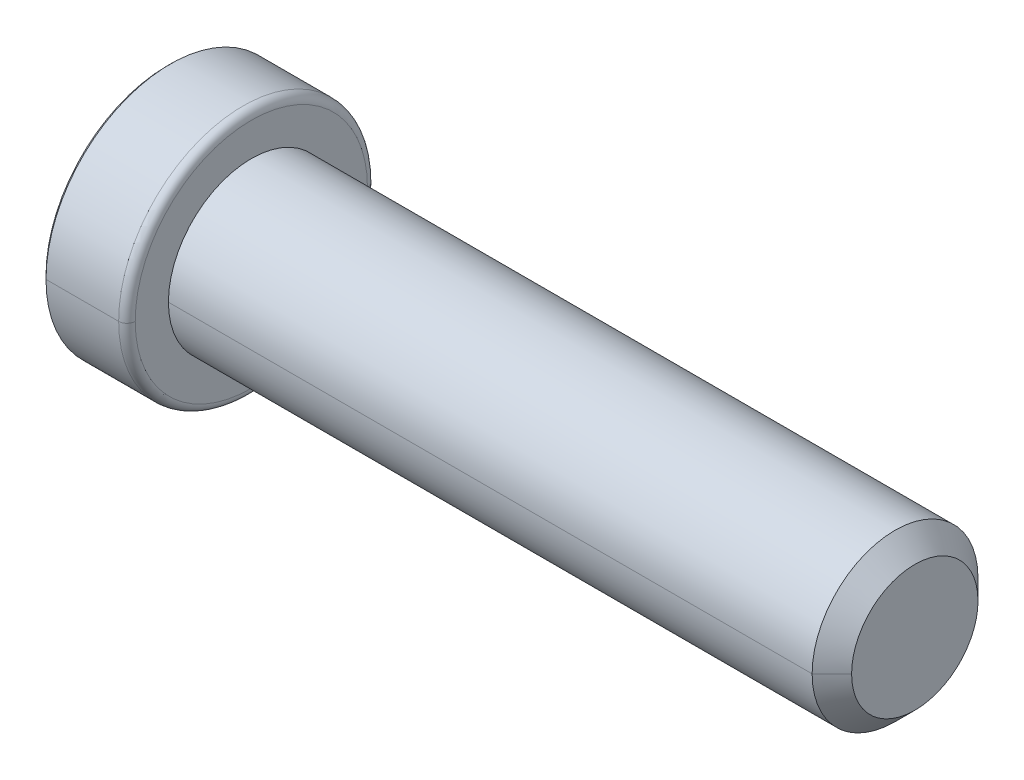
ISO-10303-21;
HEADER;
FILE_DESCRIPTION(('STEP AP214'),'2;1');
FILE_NAME('part.step','',(''),(''),'','','');
FILE_SCHEMA(('AUTOMOTIVE_DESIGN { 1 0 10303 214 1 1 1 1 }'));
ENDSEC;
DATA;
#1=APPLICATION_CONTEXT('core data for automotive mechanical design processes');
#2=APPLICATION_PROTOCOL_DEFINITION('international standard','automotive_design',2000,#1);
#3=PRODUCT_CONTEXT('',#1,'mechanical');
#4=PRODUCT('Part','Part','',(#3));
#5=PRODUCT_RELATED_PRODUCT_CATEGORY('part','',(#4));
#6=PRODUCT_DEFINITION_FORMATION('','',#4);
#7=PRODUCT_DEFINITION_CONTEXT('part definition',#1,'design');
#8=PRODUCT_DEFINITION('design','',#6,#7);
#9=PRODUCT_DEFINITION_SHAPE('','',#8);
#10=(LENGTH_UNIT() NAMED_UNIT(*) SI_UNIT(.MILLI.,.METRE.));
#11=(NAMED_UNIT(*) PLANE_ANGLE_UNIT() SI_UNIT($,.RADIAN.));
#12=(NAMED_UNIT(*) SI_UNIT($,.STERADIAN.) SOLID_ANGLE_UNIT());
#13=UNCERTAINTY_MEASURE_WITH_UNIT(LENGTH_MEASURE(1.E-05),#10,'distance_accuracy_value','');
#14=(GEOMETRIC_REPRESENTATION_CONTEXT(3) GLOBAL_UNCERTAINTY_ASSIGNED_CONTEXT((#13)) GLOBAL_UNIT_ASSIGNED_CONTEXT((#10,
#11,#12)) REPRESENTATION_CONTEXT('',''));
#15=CARTESIAN_POINT('',(0.,0.,0.));
#16=DIRECTION('',(0.,0.,1.));
#17=DIRECTION('',(1.,0.,0.));
#18=AXIS2_PLACEMENT_3D('',#15,#16,#17);
#19=CARTESIAN_POINT('',(-3.2258,0.,0.));
#20=DIRECTION('',(1.,0.,0.));
#21=DIRECTION('',(0.,-1.,0.));
#22=AXIS2_PLACEMENT_3D('',#19,#20,#21);
#23=CONICAL_SURFACE('',#22,4.6355,0.785398163397438);
#24=CARTESIAN_POINT('',(-3.0988,0.,0.));
#25=DIRECTION('',(1.,0.,0.));
#26=DIRECTION('',(0.,0.,-1.));
#27=AXIS2_PLACEMENT_3D('',#24,#25,#26);
#28=CIRCLE('',#27,4.7625);
#29=CARTESIAN_POINT('',(-3.0988,0.,-4.7625));
#30=VERTEX_POINT('',#29);
#31=CARTESIAN_POINT('',(-3.0988,0.,4.7625));
#32=VERTEX_POINT('',#31);
#33=EDGE_CURVE('E12',#30,#32,#28,.T.);
#34=ORIENTED_EDGE('',*,*,#33,.F.);
#35=CARTESIAN_POINT('',(-3.2258,0.,-4.6355));
#36=DIRECTION('',(0.707106781186555,0.,-0.70710678118654));
#37=VECTOR('',#36,1.);
#38=LINE('',#35,#37);
#39=CARTESIAN_POINT('',(-3.2258,0.,-4.6355));
#40=VERTEX_POINT('',#39);
#41=EDGE_CURVE('E30',#40,#30,#38,.T.);
#42=ORIENTED_EDGE('',*,*,#41,.F.);
#43=CARTESIAN_POINT('',(-3.2258,0.,0.));
#44=DIRECTION('',(1.,0.,0.));
#45=DIRECTION('',(0.,0.,-1.));
#46=AXIS2_PLACEMENT_3D('',#43,#44,#45);
#47=CIRCLE('',#46,4.6355);
#48=CARTESIAN_POINT('',(-3.2258,0.,4.6355));
#49=VERTEX_POINT('',#48);
#50=EDGE_CURVE('E211',#40,#49,#47,.T.);
#51=ORIENTED_EDGE('',*,*,#50,.T.);
#52=CARTESIAN_POINT('',(-3.2258,0.,4.6355));
#53=DIRECTION('',(0.707106781186555,0.,0.70710678118654));
#54=VECTOR('',#53,1.);
#55=LINE('',#52,#54);
#56=EDGE_CURVE('E209',#49,#32,#55,.T.);
#57=ORIENTED_EDGE('',*,*,#56,.T.);
#58=EDGE_LOOP('',(#34,#42,#51,#57));
#59=FACE_BOUND('',#58,.T.);
#60=ADVANCED_FACE('F20',(#59),#23,.T.);
#61=CARTESIAN_POINT('',(-3.2258,0.,0.));
#62=DIRECTION('',(1.,0.,0.));
#63=DIRECTION('',(0.,1.,0.));
#64=AXIS2_PLACEMENT_3D('',#61,#62,#63);
#65=CONICAL_SURFACE('',#64,4.6355,0.785398163397438);
#66=CARTESIAN_POINT('',(-3.2258,0.,0.));
#67=DIRECTION('',(1.,0.,0.));
#68=DIRECTION('',(0.,0.,-1.));
#69=AXIS2_PLACEMENT_3D('',#66,#67,#68);
#70=CIRCLE('',#69,4.6355);
#71=EDGE_CURVE('E195',#49,#40,#70,.T.);
#72=ORIENTED_EDGE('',*,*,#71,.T.);
#73=ORIENTED_EDGE('',*,*,#41,.T.);
#74=CARTESIAN_POINT('',(-3.0988,0.,0.));
#75=DIRECTION('',(1.,0.,0.));
#76=DIRECTION('',(0.,0.,-1.));
#77=AXIS2_PLACEMENT_3D('',#74,#75,#76);
#78=CIRCLE('',#77,4.7625);
#79=EDGE_CURVE('E364',#32,#30,#78,.T.);
#80=ORIENTED_EDGE('',*,*,#79,.F.);
#81=ORIENTED_EDGE('',*,*,#56,.F.);
#82=EDGE_LOOP('',(#72,#73,#80,#81));
#83=FACE_BOUND('',#82,.T.);
#84=ADVANCED_FACE('F338',(#83),#65,.T.);
#85=CARTESIAN_POINT('',(25.4,0.,0.));
#86=DIRECTION('',(-1.,0.,0.));
#87=DIRECTION('',(0.,1.,0.));
#88=AXIS2_PLACEMENT_3D('',#85,#86,#87);
#89=CYLINDRICAL_SURFACE('',#88,4.7625);
#90=ORIENTED_EDGE('',*,*,#79,.T.);
#91=CARTESIAN_POINT('',(-0.317499999999991,0.,-4.7625));
#92=DIRECTION('',(-1.,0.,0.));
#93=VECTOR('',#92,1.);
#94=LINE('',#91,#93);
#95=CARTESIAN_POINT('',(-0.317499999999992,0.,-4.7625));
#96=VERTEX_POINT('',#95);
#97=EDGE_CURVE('E367',#96,#30,#94,.T.);
#98=ORIENTED_EDGE('',*,*,#97,.F.);
#99=CARTESIAN_POINT('',(-0.317499999999992,0.,0.));
#100=DIRECTION('',(1.,0.,0.));
#101=DIRECTION('',(0.,0.,-1.));
#102=AXIS2_PLACEMENT_3D('',#99,#100,#101);
#103=CIRCLE('',#102,4.7625);
#104=CARTESIAN_POINT('',(-0.317500000000048,0.,4.7625));
#105=VERTEX_POINT('',#104);
#106=EDGE_CURVE('E373',#105,#96,#103,.T.);
#107=ORIENTED_EDGE('',*,*,#106,.F.);
#108=CARTESIAN_POINT('',(-0.317499999999991,0.,4.7625));
#109=DIRECTION('',(-1.,0.,0.));
#110=VECTOR('',#109,1.);
#111=LINE('',#108,#110);
#112=EDGE_CURVE('E379',#105,#32,#111,.T.);
#113=ORIENTED_EDGE('',*,*,#112,.T.);
#114=EDGE_LOOP('',(#90,#98,#107,#113));
#115=FACE_BOUND('',#114,.T.);
#116=ADVANCED_FACE('F347',(#115),#89,.T.);
#117=CARTESIAN_POINT('',(25.4,0.,0.));
#118=DIRECTION('',(-1.,0.,0.));
#119=DIRECTION('',(0.,-1.,0.));
#120=AXIS2_PLACEMENT_3D('',#117,#118,#119);
#121=CYLINDRICAL_SURFACE('',#120,4.7625);
#122=CARTESIAN_POINT('',(-0.317499999999992,0.,0.));
#123=DIRECTION('',(1.,0.,0.));
#124=DIRECTION('',(0.,0.,-1.));
#125=AXIS2_PLACEMENT_3D('',#122,#123,#124);
#126=CIRCLE('',#125,4.7625);
#127=EDGE_CURVE('E385',#96,#105,#126,.T.);
#128=ORIENTED_EDGE('',*,*,#127,.F.);
#129=ORIENTED_EDGE('',*,*,#97,.T.);
#130=ORIENTED_EDGE('',*,*,#33,.T.);
#131=ORIENTED_EDGE('',*,*,#112,.F.);
#132=EDGE_LOOP('',(#128,#129,#130,#131));
#133=FACE_BOUND('',#132,.T.);
#134=ADVANCED_FACE('F408',(#133),#121,.T.);
#135=CARTESIAN_POINT('',(-0.317500000000048,0.,0.));
#136=DIRECTION('',(1.,0.,0.));
#137=DIRECTION('',(0.,-1.,0.));
#138=AXIS2_PLACEMENT_3D('',#135,#136,#137);
#139=TOROIDAL_SURFACE('',#138,4.44499999999995,0.317500000000048);
#140=CARTESIAN_POINT('',(0.,0.,0.));
#141=DIRECTION('',(1.,0.,0.));
#142=DIRECTION('',(0.,0.,-1.));
#143=AXIS2_PLACEMENT_3D('',#140,#141,#142);
#144=CIRCLE('',#143,4.44499999999995);
#145=CARTESIAN_POINT('',(0.,0.,-4.44499999999995));
#146=VERTEX_POINT('',#145);
#147=CARTESIAN_POINT('',(0.,0.,4.44499999999995));
#148=VERTEX_POINT('',#147);
#149=EDGE_CURVE('E431',#146,#148,#144,.T.);
#150=ORIENTED_EDGE('',*,*,#149,.F.);
#151=CARTESIAN_POINT('',(-0.317500000000049,0.,-4.7625));
#152=CARTESIAN_POINT('',(-0.312304913152215,0.,-4.76250011020068));
#153=CARTESIAN_POINT('',(-0.30710983568138,0.,-4.76237249743723));
#154=CARTESIAN_POINT('',(-0.296732191120802,0.,-4.76186261725305));
#155=CARTESIAN_POINT('',(-0.291549624031059,0.,-4.76148034983231));
#156=CARTESIAN_POINT('',(-0.281209491859759,0.,-4.76046195160453));
#157=CARTESIAN_POINT('',(-0.276051926778202,0.,-4.75982582079749));
#158=CARTESIAN_POINT('',(-0.265774221942727,0.,-4.75830126303014));
#159=CARTESIAN_POINT('',(-0.260654082188809,0.,-4.75741283606983));
#160=CARTESIAN_POINT('',(-0.250463563331028,0.,-4.75538581698622));
#161=CARTESIAN_POINT('',(-0.245393184227164,0.,-4.75424722486293));
#162=CARTESIAN_POINT('',(-0.235314401534338,0.,-4.7517226209156));
#163=CARTESIAN_POINT('',(-0.230305997945375,0.,-4.75033660909157));
#164=CARTESIAN_POINT('',(-0.220363231998111,0.,-4.74732050409837));
#165=CARTESIAN_POINT('',(-0.215428869639811,0.,-4.7456904109292));
#166=CARTESIAN_POINT('',(-0.205646073456195,0.,-4.74219007046201));
#167=CARTESIAN_POINT('',(-0.20079763963088,0.,-4.74031982316399));
#168=CARTESIAN_POINT('',(-0.191198380817349,0.,-4.73634367998067));
#169=CARTESIAN_POINT('',(-0.186447555829134,0.,-4.73423778409537));
#170=CARTESIAN_POINT('',(-0.177054959842693,0.,-4.729795417038));
#171=CARTESIAN_POINT('',(-0.172413188844467,0.,-4.72745894586593));
#172=CARTESIAN_POINT('',(-0.163249883271077,0.,-4.72256105699526));
#173=CARTESIAN_POINT('',(-0.158728348695914,0.,-4.71999963929667));
#174=CARTESIAN_POINT('',(-0.149816408741438,0.,-4.71465802805348));
#175=CARTESIAN_POINT('',(-0.145426003362125,0.,-4.71187783450889));
#176=CARTESIAN_POINT('',(-0.136786898670472,0.,-4.70610536930321));
#177=CARTESIAN_POINT('',(-0.132538199358133,0.,-4.70311309764212));
#178=CARTESIAN_POINT('',(-0.124192742289212,0.,-4.69692368484806));
#179=CARTESIAN_POINT('',(-0.12009598453263,0.,-4.69372654371508));
#180=CARTESIAN_POINT('',(-0.112064280023492,0.,-4.68713509417023));
#181=CARTESIAN_POINT('',(-0.108129333270937,0.,-4.68374078575836));
#182=CARTESIAN_POINT('',(-0.10043073040124,0.,-4.67676317884201));
#183=CARTESIAN_POINT('',(-0.0966670742840983,0.,-4.67317988033752));
#184=CARTESIAN_POINT('',(-0.0893201196624735,0.,-4.6658329257159));
#185=CARTESIAN_POINT('',(-0.0857368211579901,0.,-4.66206926959876));
#186=CARTESIAN_POINT('',(-0.0787592142416371,0.,-4.65437066672906));
#187=CARTESIAN_POINT('',(-0.0753649058297675,0.,-4.65043571997651));
#188=CARTESIAN_POINT('',(-0.0687734562849175,0.,-4.64240401546737));
#189=CARTESIAN_POINT('',(-0.0655763151519371,0.,-4.63830725771079));
#190=CARTESIAN_POINT('',(-0.0593869023578734,0.,-4.62996180064187));
#191=CARTESIAN_POINT('',(-0.0563946306967903,0.,-4.62571310132953));
#192=CARTESIAN_POINT('',(-0.0506221654911109,0.,-4.61707399663787));
#193=CARTESIAN_POINT('',(-0.0478419719465147,0.,-4.61268359125856));
#194=CARTESIAN_POINT('',(-0.0425003607033272,0.,-4.60377165130408));
#195=CARTESIAN_POINT('',(-0.0399389430047359,0.,-4.59925011672892));
#196=CARTESIAN_POINT('',(-0.0350410541340709,0.,-4.59008681115553));
#197=CARTESIAN_POINT('',(-0.0327045829619971,0.,-4.58544504015731));
#198=CARTESIAN_POINT('',(-0.0282622159046264,0.,-4.57605244417086));
#199=CARTESIAN_POINT('',(-0.0261563200193295,0.,-4.57130161918265));
#200=CARTESIAN_POINT('',(-0.0221801768360115,0.,-4.56170236036912));
#201=CARTESIAN_POINT('',(-0.0203099295379903,0.,-4.5568539265438));
#202=CARTESIAN_POINT('',(-0.0168095890707978,0.,-4.54707113036019));
#203=CARTESIAN_POINT('',(-0.0151794959016266,0.,-4.54213676800189));
#204=CARTESIAN_POINT('',(-0.0121633909084255,0.,-4.53219400205462));
#205=CARTESIAN_POINT('',(-0.0107773790843956,0.,-4.52718559846566));
#206=CARTESIAN_POINT('',(-0.00825277513707223,0.,-4.51710681577283));
#207=CARTESIAN_POINT('',(-0.00711418301377874,0.,-4.51203643666897));
#208=CARTESIAN_POINT('',(-0.00508716393017219,0.,-4.50184591781119));
#209=CARTESIAN_POINT('',(-0.00419873696985912,0.,-4.49672577805727));
#210=CARTESIAN_POINT('',(-0.00267417920250627,0.,-4.4864480732218));
#211=CARTESIAN_POINT('',(-0.00203804839546648,0.,-4.48129050814024));
#212=CARTESIAN_POINT('',(-0.00101965016768919,0.,-4.47095037596894));
#213=CARTESIAN_POINT('',(-0.000637382746951681,0.,-4.4657678088792));
#214=CARTESIAN_POINT('',(-0.000127502562764044,0.,-4.45539016431862));
#215=CARTESIAN_POINT('',(1.10200686090799E-07,0.,-4.45019508684778));
#216=CARTESIAN_POINT('',(0.,0.,-4.44499999999995));
#217=B_SPLINE_CURVE_WITH_KNOTS('',3,(#151,#152,#153,#154,#155,#156,#157,#158,#159,#160,#161,
#162,#163,#164,#165,#166,#167,#168,#169,#170,#171,#172,#173,#174,#175,#176,#177,#178,#179,#180,
#181,#182,#183,#184,#185,#186,#187,#188,#189,#190,#191,#192,#193,#194,#195,#196,#197,#198,#199,
#200,#201,#202,#203,#204,#205,#206,#207,#208,#209,#210,#211,#212,#213,#214,#215,#216),
.UNSPECIFIED.,.F.,.F.,(4,2,2,2,2,2,2,2,2,2,2,2,2,2,2,2,2,2,2,2,2,2,2,2,2,2,2,2,2,2,2,2,4),(0.,
0.0155836801120517,0.0311673602241033,0.046751040336155,0.0623347204482066,0.0779184005602584,
0.09350208067231,0.109085760784362,0.124669440896413,0.140253121008465,0.155836801120517,
0.171420481232568,0.18700416134462,0.202587841456671,0.218171521568723,0.233755201680775,
0.249338881792827,0.264922561904878,0.28050624201693,0.296089922128982,0.311673602241033,
0.327257282353084,0.342840962465136,0.358424642577188,0.37400832268924,0.389592002801291,
0.405175682913343,0.420759363025394,0.436343043137447,0.451926723249498,0.46751040336155,
0.483094083473602,0.498677763585653),.UNSPECIFIED.);
#218=EDGE_CURVE('E436',#96,#146,#217,.T.);
#219=ORIENTED_EDGE('',*,*,#218,.F.);
#220=ORIENTED_EDGE('',*,*,#127,.T.);
#221=CARTESIAN_POINT('',(-0.317500000000049,0.,4.7625));
#222=CARTESIAN_POINT('',(-0.312304913152215,0.,4.76250011020068));
#223=CARTESIAN_POINT('',(-0.30710983568138,0.,4.76237249743723));
#224=CARTESIAN_POINT('',(-0.296732191120802,0.,4.76186261725305));
#225=CARTESIAN_POINT('',(-0.291549624031058,0.,4.76148034983231));
#226=CARTESIAN_POINT('',(-0.281209491859758,0.,4.76046195160453));
#227=CARTESIAN_POINT('',(-0.276051926778201,0.,4.75982582079749));
#228=CARTESIAN_POINT('',(-0.265774221942727,0.,4.75830126303014));
#229=CARTESIAN_POINT('',(-0.260654082188809,0.,4.75741283606983));
#230=CARTESIAN_POINT('',(-0.250463563331028,0.,4.75538581698622));
#231=CARTESIAN_POINT('',(-0.245393184227164,0.,4.75424722486293));
#232=CARTESIAN_POINT('',(-0.235314401534337,0.,4.7517226209156));
#233=CARTESIAN_POINT('',(-0.230305997945375,0.,4.75033660909157));
#234=CARTESIAN_POINT('',(-0.220363231998111,0.,4.74732050409837));
#235=CARTESIAN_POINT('',(-0.21542886963981,0.,4.7456904109292));
#236=CARTESIAN_POINT('',(-0.205646073456195,0.,4.74219007046201));
#237=CARTESIAN_POINT('',(-0.200797639630879,0.,4.74031982316399));
#238=CARTESIAN_POINT('',(-0.191198380817349,0.,4.73634367998067));
#239=CARTESIAN_POINT('',(-0.186447555829134,0.,4.73423778409537));
#240=CARTESIAN_POINT('',(-0.177054959842693,0.,4.729795417038));
#241=CARTESIAN_POINT('',(-0.172413188844466,0.,4.72745894586593));
#242=CARTESIAN_POINT('',(-0.163249883271077,0.,4.72256105699526));
#243=CARTESIAN_POINT('',(-0.158728348695914,0.,4.71999963929667));
#244=CARTESIAN_POINT('',(-0.149816408741438,0.,4.71465802805348));
#245=CARTESIAN_POINT('',(-0.145426003362124,0.,4.71187783450889));
#246=CARTESIAN_POINT('',(-0.136786898670472,0.,4.70610536930321));
#247=CARTESIAN_POINT('',(-0.132538199358133,0.,4.70311309764212));
#248=CARTESIAN_POINT('',(-0.124192742289212,0.,4.69692368484806));
#249=CARTESIAN_POINT('',(-0.120095984532629,0.,4.69372654371508));
#250=CARTESIAN_POINT('',(-0.112064280023492,0.,4.68713509417023));
#251=CARTESIAN_POINT('',(-0.108129333270936,0.,4.68374078575836));
#252=CARTESIAN_POINT('',(-0.100430730401239,0.,4.67676317884201));
#253=CARTESIAN_POINT('',(-0.0966670742840981,0.,4.67317988033752));
#254=CARTESIAN_POINT('',(-0.0893201196624733,0.,4.6658329257159));
#255=CARTESIAN_POINT('',(-0.0857368211579898,0.,4.66206926959876));
#256=CARTESIAN_POINT('',(-0.0787592142416368,0.,4.65437066672906));
#257=CARTESIAN_POINT('',(-0.0753649058297673,0.,4.65043571997651));
#258=CARTESIAN_POINT('',(-0.0687734562849173,0.,4.64240401546737));
#259=CARTESIAN_POINT('',(-0.0655763151519369,0.,4.63830725771079));
#260=CARTESIAN_POINT('',(-0.0593869023578732,0.,4.62996180064187));
#261=CARTESIAN_POINT('',(-0.0563946306967899,0.,4.62571310132953));
#262=CARTESIAN_POINT('',(-0.0506221654911106,0.,4.61707399663787));
#263=CARTESIAN_POINT('',(-0.0478419719465145,0.,4.61268359125856));
#264=CARTESIAN_POINT('',(-0.0425003607033271,0.,4.60377165130408));
#265=CARTESIAN_POINT('',(-0.0399389430047357,0.,4.59925011672892));
#266=CARTESIAN_POINT('',(-0.0350410541340706,0.,4.59008681115553));
#267=CARTESIAN_POINT('',(-0.032704582961997,0.,4.58544504015731));
#268=CARTESIAN_POINT('',(-0.0282622159046263,0.,4.57605244417086));
#269=CARTESIAN_POINT('',(-0.0261563200193293,0.,4.57130161918265));
#270=CARTESIAN_POINT('',(-0.0221801768360112,0.,4.56170236036912));
#271=CARTESIAN_POINT('',(-0.0203099295379901,0.,4.5568539265438));
#272=CARTESIAN_POINT('',(-0.0168095890707977,0.,4.54707113036019));
#273=CARTESIAN_POINT('',(-0.0151794959016264,0.,4.54213676800189));
#274=CARTESIAN_POINT('',(-0.0121633909084254,0.,4.53219400205462));
#275=CARTESIAN_POINT('',(-0.0107773790843956,0.,4.52718559846566));
#276=CARTESIAN_POINT('',(-0.00825277513707223,0.,4.51710681577283));
#277=CARTESIAN_POINT('',(-0.00711418301377868,0.,4.51203643666897));
#278=CARTESIAN_POINT('',(-0.00508716393017209,0.,4.50184591781119));
#279=CARTESIAN_POINT('',(-0.00419873696985906,0.,4.49672577805727));
#280=CARTESIAN_POINT('',(-0.00267417920250622,0.,4.4864480732218));
#281=CARTESIAN_POINT('',(-0.00203804839546642,0.,4.48129050814024));
#282=CARTESIAN_POINT('',(-0.00101965016768914,0.,4.47095037596894));
#283=CARTESIAN_POINT('',(-0.000637382746951662,0.,4.4657678088792));
#284=CARTESIAN_POINT('',(-0.000127502562764064,0.,4.45539016431862));
#285=CARTESIAN_POINT('',(1.10200686060685E-07,0.,4.45019508684778));
#286=CARTESIAN_POINT('',(0.,0.,4.44499999999995));
#287=B_SPLINE_CURVE_WITH_KNOTS('',3,(#221,#222,#223,#224,#225,#226,#227,#228,#229,#230,#231,
#232,#233,#234,#235,#236,#237,#238,#239,#240,#241,#242,#243,#244,#245,#246,#247,#248,#249,#250,
#251,#252,#253,#254,#255,#256,#257,#258,#259,#260,#261,#262,#263,#264,#265,#266,#267,#268,#269,
#270,#271,#272,#273,#274,#275,#276,#277,#278,#279,#280,#281,#282,#283,#284,#285,#286),
.UNSPECIFIED.,.F.,.F.,(4,2,2,2,2,2,2,2,2,2,2,2,2,2,2,2,2,2,2,2,2,2,2,2,2,2,2,2,2,2,2,2,4),(0.,
0.0155836801120517,0.0311673602241033,0.0467510403361549,0.0623347204482066,0.0779184005602584,
0.09350208067231,0.109085760784362,0.124669440896413,0.140253121008465,0.155836801120517,
0.171420481232568,0.18700416134462,0.202587841456671,0.218171521568723,0.233755201680775,
0.249338881792827,0.264922561904878,0.28050624201693,0.296089922128981,0.311673602241033,
0.327257282353085,0.342840962465137,0.358424642577188,0.37400832268924,0.389592002801292,
0.405175682913343,0.420759363025395,0.436343043137446,0.451926723249498,0.46751040336155,
0.483094083473601,0.498677763585653),.UNSPECIFIED.);
#288=EDGE_CURVE('E450',#105,#148,#287,.T.);
#289=ORIENTED_EDGE('',*,*,#288,.T.);
#290=EDGE_LOOP('',(#150,#219,#220,#289));
#291=FACE_BOUND('',#290,.T.);
#292=ADVANCED_FACE('F417',(#291),#139,.T.);
#293=CARTESIAN_POINT('',(-0.317500000000048,0.,0.));
#294=DIRECTION('',(1.,0.,0.));
#295=DIRECTION('',(0.,1.,0.));
#296=AXIS2_PLACEMENT_3D('',#293,#294,#295);
#297=TOROIDAL_SURFACE('',#296,4.44499999999995,0.317500000000048);
#298=ORIENTED_EDGE('',*,*,#106,.T.);
#299=ORIENTED_EDGE('',*,*,#218,.T.);
#300=CARTESIAN_POINT('',(0.,0.,0.));
#301=DIRECTION('',(1.,0.,0.));
#302=DIRECTION('',(0.,0.,-1.));
#303=AXIS2_PLACEMENT_3D('',#300,#301,#302);
#304=CIRCLE('',#303,4.44499999999995);
#305=EDGE_CURVE('E490',#148,#146,#304,.T.);
#306=ORIENTED_EDGE('',*,*,#305,.F.);
#307=ORIENTED_EDGE('',*,*,#288,.F.);
#308=EDGE_LOOP('',(#298,#299,#306,#307));
#309=FACE_BOUND('',#308,.T.);
#310=ADVANCED_FACE('F467',(#309),#297,.T.);
#311=CARTESIAN_POINT('',(0.,4.445,0.));
#312=DIRECTION('',(-1.,0.,0.));
#313=DIRECTION('',(0.,0.,1.));
#314=AXIS2_PLACEMENT_3D('',#311,#312,#313);
#315=PLANE('',#314);
#316=CARTESIAN_POINT('',(0.,0.,0.));
#317=DIRECTION('',(1.,0.,0.));
#318=DIRECTION('',(0.,0.,-1.));
#319=AXIS2_PLACEMENT_3D('',#316,#317,#318);
#320=CIRCLE('',#319,3.175);
#321=CARTESIAN_POINT('',(0.,0.,-3.175));
#322=VERTEX_POINT('',#321);
#323=CARTESIAN_POINT('',(0.,0.,3.175));
#324=VERTEX_POINT('',#323);
#325=EDGE_CURVE('E492',#322,#324,#320,.T.);
#326=ORIENTED_EDGE('',*,*,#325,.F.);
#327=CARTESIAN_POINT('',(0.,0.,0.));
#328=DIRECTION('',(1.,0.,0.));
#329=DIRECTION('',(0.,0.,-1.));
#330=AXIS2_PLACEMENT_3D('',#327,#328,#329);
#331=CIRCLE('',#330,3.175);
#332=EDGE_CURVE('E497',#324,#322,#331,.T.);
#333=ORIENTED_EDGE('',*,*,#332,.F.);
#334=EDGE_LOOP('',(#326,#333));
#335=FACE_BOUND('',#334,.T.);
#336=ORIENTED_EDGE('',*,*,#149,.T.);
#337=ORIENTED_EDGE('',*,*,#305,.T.);
#338=EDGE_LOOP('',(#336,#337));
#339=FACE_BOUND('',#338,.T.);
#340=ADVANCED_FACE('F476',(#335,#339),#315,.F.);
#341=CARTESIAN_POINT('',(25.4,0.,0.));
#342=DIRECTION('',(-1.,0.,0.));
#343=DIRECTION('',(0.,1.,0.));
#344=AXIS2_PLACEMENT_3D('',#341,#342,#343);
#345=CYLINDRICAL_SURFACE('',#344,3.175);
#346=ORIENTED_EDGE('',*,*,#332,.T.);
#347=CARTESIAN_POINT('',(24.64435,0.,-3.175));
#348=DIRECTION('',(-1.,0.,0.));
#349=VECTOR('',#348,1.);
#350=LINE('',#347,#349);
#351=CARTESIAN_POINT('',(24.64435,0.,-3.175));
#352=VERTEX_POINT('',#351);
#353=EDGE_CURVE('E503',#352,#322,#350,.T.);
#354=ORIENTED_EDGE('',*,*,#353,.F.);
#355=CARTESIAN_POINT('',(24.64435,0.,0.));
#356=DIRECTION('',(1.,0.,0.));
#357=DIRECTION('',(0.,0.,-1.));
#358=AXIS2_PLACEMENT_3D('',#355,#356,#357);
#359=CIRCLE('',#358,3.175);
#360=CARTESIAN_POINT('',(24.64435,0.,3.175));
#361=VERTEX_POINT('',#360);
#362=EDGE_CURVE('E546',#361,#352,#359,.T.);
#363=ORIENTED_EDGE('',*,*,#362,.F.);
#364=CARTESIAN_POINT('',(24.64435,0.,3.175));
#365=DIRECTION('',(-1.,0.,0.));
#366=VECTOR('',#365,1.);
#367=LINE('',#364,#366);
#368=EDGE_CURVE('E548',#361,#324,#367,.T.);
#369=ORIENTED_EDGE('',*,*,#368,.T.);
#370=EDGE_LOOP('',(#346,#354,#363,#369));
#371=FACE_BOUND('',#370,.T.);
#372=ADVANCED_FACE('F524',(#371),#345,.T.);
#373=CARTESIAN_POINT('',(25.4,0.,0.));
#374=DIRECTION('',(-1.,0.,0.));
#375=DIRECTION('',(0.,-1.,0.));
#376=AXIS2_PLACEMENT_3D('',#373,#374,#375);
#377=CYLINDRICAL_SURFACE('',#376,3.175);
#378=CARTESIAN_POINT('',(24.64435,0.,0.));
#379=DIRECTION('',(1.,0.,0.));
#380=DIRECTION('',(0.,0.,-1.));
#381=AXIS2_PLACEMENT_3D('',#378,#379,#380);
#382=CIRCLE('',#381,3.175);
#383=EDGE_CURVE('E515',#352,#361,#382,.T.);
#384=ORIENTED_EDGE('',*,*,#383,.F.);
#385=ORIENTED_EDGE('',*,*,#353,.T.);
#386=ORIENTED_EDGE('',*,*,#325,.T.);
#387=ORIENTED_EDGE('',*,*,#368,.F.);
#388=EDGE_LOOP('',(#384,#385,#386,#387));
#389=FACE_BOUND('',#388,.T.);
#390=ADVANCED_FACE('F532',(#389),#377,.T.);
#391=CARTESIAN_POINT('',(24.64435,0.,0.));
#392=DIRECTION('',(-1.,0.,0.));
#393=DIRECTION('',(0.,-1.,0.));
#394=AXIS2_PLACEMENT_3D('',#391,#392,#393);
#395=CONICAL_SURFACE('',#394,3.175,0.785398163397446);
#396=CARTESIAN_POINT('',(25.4,0.,0.));
#397=DIRECTION('',(1.,0.,0.));
#398=DIRECTION('',(0.,0.,-1.));
#399=AXIS2_PLACEMENT_3D('',#396,#397,#398);
#400=CIRCLE('',#399,2.41935);
#401=CARTESIAN_POINT('',(25.4,0.,-2.41935));
#402=VERTEX_POINT('',#401);
#403=CARTESIAN_POINT('',(25.4,0.,2.41935));
#404=VERTEX_POINT('',#403);
#405=EDGE_CURVE('E551',#402,#404,#400,.T.);
#406=ORIENTED_EDGE('',*,*,#405,.F.);
#407=CARTESIAN_POINT('',(25.4,0.,-2.41935));
#408=DIRECTION('',(-0.707106781186549,0.,-0.707106781186546));
#409=VECTOR('',#408,1.);
#410=LINE('',#407,#409);
#411=EDGE_CURVE('E302',#402,#352,#410,.T.);
#412=ORIENTED_EDGE('',*,*,#411,.T.);
#413=ORIENTED_EDGE('',*,*,#383,.T.);
#414=CARTESIAN_POINT('',(25.4,0.,2.41935));
#415=DIRECTION('',(-0.707106781186549,0.,0.707106781186545));
#416=VECTOR('',#415,1.);
#417=LINE('',#414,#416);
#418=EDGE_CURVE('E315',#404,#361,#417,.T.);
#419=ORIENTED_EDGE('',*,*,#418,.F.);
#420=EDGE_LOOP('',(#406,#412,#413,#419));
#421=FACE_BOUND('',#420,.T.);
#422=ADVANCED_FACE('F280',(#421),#395,.T.);
#423=CARTESIAN_POINT('',(24.64435,0.,0.));
#424=DIRECTION('',(-1.,0.,0.));
#425=DIRECTION('',(0.,1.,0.));
#426=AXIS2_PLACEMENT_3D('',#423,#424,#425);
#427=CONICAL_SURFACE('',#426,3.175,0.785398163397446);
#428=ORIENTED_EDGE('',*,*,#362,.T.);
#429=ORIENTED_EDGE('',*,*,#411,.F.);
#430=CARTESIAN_POINT('',(25.4,0.,0.));
#431=DIRECTION('',(1.,0.,0.));
#432=DIRECTION('',(0.,0.,-1.));
#433=AXIS2_PLACEMENT_3D('',#430,#431,#432);
#434=CIRCLE('',#433,2.41935);
#435=EDGE_CURVE('E258',#404,#402,#434,.T.);
#436=ORIENTED_EDGE('',*,*,#435,.F.);
#437=ORIENTED_EDGE('',*,*,#418,.T.);
#438=EDGE_LOOP('',(#428,#429,#436,#437));
#439=FACE_BOUND('',#438,.T.);
#440=ADVANCED_FACE('F269',(#439),#427,.T.);
#441=CARTESIAN_POINT('',(25.4,2.41935,0.));
#442=DIRECTION('',(-1.,0.,0.));
#443=DIRECTION('',(0.,0.,1.));
#444=AXIS2_PLACEMENT_3D('',#441,#442,#443);
#445=PLANE('',#444);
#446=ORIENTED_EDGE('',*,*,#405,.T.);
#447=ORIENTED_EDGE('',*,*,#435,.T.);
#448=EDGE_LOOP('',(#446,#447));
#449=FACE_BOUND('',#448,.T.);
#450=ADVANCED_FACE('F279',(#449),#445,.F.);
#451=CARTESIAN_POINT('',(-3.2258,0.,0.));
#452=DIRECTION('',(1.,0.,0.));
#453=DIRECTION('',(0.,0.,-1.));
#454=AXIS2_PLACEMENT_3D('',#451,#452,#453);
#455=PLANE('',#454);
#456=ORIENTED_EDGE('',*,*,#50,.F.);
#457=ORIENTED_EDGE('',*,*,#71,.F.);
#458=EDGE_LOOP('',(#456,#457));
#459=FACE_BOUND('',#458,.T.);
#460=DIRECTION('',(0.,-1.,0.));
#461=VECTOR('',#460,1.);
#462=CARTESIAN_POINT('',(-3.2258,0.916543552338531,1.5875));
#463=LINE('',#462,#461);
#464=CARTESIAN_POINT('',(-3.2258,0.916543552338531,1.5875));
#465=VERTEX_POINT('',#464);
#466=CARTESIAN_POINT('',(-3.2258,-0.916543552338531,1.5875));
#467=VERTEX_POINT('',#466);
#468=EDGE_CURVE('E253',#465,#467,#463,.T.);
#469=ORIENTED_EDGE('',*,*,#468,.T.);
#470=DIRECTION('',(0.,-0.500000000000016,-0.866025403784429));
#471=VECTOR('',#470,1.);
#472=CARTESIAN_POINT('',(-3.2258,-0.916543552338531,1.5875));
#473=LINE('',#472,#471);
#474=CARTESIAN_POINT('',(-3.2258,-1.8330871046771,0.));
#475=VERTEX_POINT('',#474);
#476=EDGE_CURVE('E250',#467,#475,#473,.T.);
#477=ORIENTED_EDGE('',*,*,#476,.T.);
#478=DIRECTION('',(0.,0.500000000000016,-0.866025403784429));
#479=VECTOR('',#478,1.);
#480=CARTESIAN_POINT('',(-3.2258,-1.8330871046771,0.));
#481=LINE('',#480,#479);
#482=CARTESIAN_POINT('',(-3.2258,-0.916543552338531,-1.5875));
#483=VERTEX_POINT('',#482);
#484=EDGE_CURVE('E241',#475,#483,#481,.T.);
#485=ORIENTED_EDGE('',*,*,#484,.T.);
#486=DIRECTION('',(0.,1.,0.));
#487=VECTOR('',#486,1.);
#488=CARTESIAN_POINT('',(-3.2258,-0.916543552338531,-1.5875));
#489=LINE('',#488,#487);
#490=CARTESIAN_POINT('',(-3.2258,0.916543552338531,-1.5875));
#491=VERTEX_POINT('',#490);
#492=EDGE_CURVE('E235',#483,#491,#489,.T.);
#493=ORIENTED_EDGE('',*,*,#492,.T.);
#494=DIRECTION('',(0.,0.500000000000016,0.866025403784429));
#495=VECTOR('',#494,1.);
#496=CARTESIAN_POINT('',(-3.2258,0.916543552338531,-1.5875));
#497=LINE('',#496,#495);
#498=CARTESIAN_POINT('',(-3.2258,1.8330871046771,0.));
#499=VERTEX_POINT('',#498);
#500=EDGE_CURVE('E133',#491,#499,#497,.T.);
#501=ORIENTED_EDGE('',*,*,#500,.T.);
#502=DIRECTION('',(0.,-0.500000000000016,0.866025403784429));
#503=VECTOR('',#502,1.);
#504=CARTESIAN_POINT('',(-3.2258,1.8330871046771,0.));
#505=LINE('',#504,#503);
#506=EDGE_CURVE('E231',#499,#465,#505,.T.);
#507=ORIENTED_EDGE('',*,*,#506,.T.);
#508=EDGE_LOOP('',(#469,#477,#485,#493,#501,#507));
#509=FACE_BOUND('',#508,.T.);
#510=ADVANCED_FACE('F580',(#459,#509),#455,.F.);
#511=CARTESIAN_POINT('',(-1.6129,1.8330871046771,0.));
#512=DIRECTION('',(0.,-0.866025403784429,-0.500000000000016));
#513=DIRECTION('',(0.,0.500000000000016,-0.866025403784429));
#514=AXIS2_PLACEMENT_3D('',#511,#512,#513);
#515=PLANE('',#514);
#516=ORIENTED_EDGE('',*,*,#506,.F.);
#517=DIRECTION('',(-1.,0.,0.));
#518=VECTOR('',#517,1.);
#519=CARTESIAN_POINT('',(-1.6129,1.8330871046771,0.));
#520=LINE('',#519,#518);
#521=CARTESIAN_POINT('',(-1.6129,1.8330871046771,0.));
#522=VERTEX_POINT('',#521);
#523=EDGE_CURVE('E564',#522,#499,#520,.T.);
#524=ORIENTED_EDGE('',*,*,#523,.F.);
#525=DIRECTION('',(0.,-0.500000000000016,0.866025403784429));
#526=VECTOR('',#525,1.);
#527=CARTESIAN_POINT('',(-1.6129,1.8330871046771,0.));
#528=LINE('',#527,#526);
#529=CARTESIAN_POINT('',(-1.6129,0.916543552338531,1.5875));
#530=VERTEX_POINT('',#529);
#531=EDGE_CURVE('E138',#522,#530,#528,.T.);
#532=ORIENTED_EDGE('',*,*,#531,.T.);
#533=DIRECTION('',(-1.,0.,0.));
#534=VECTOR('',#533,1.);
#535=CARTESIAN_POINT('',(-1.6129,0.916543552338531,1.5875));
#536=LINE('',#535,#534);
#537=EDGE_CURVE('E178',#530,#465,#536,.T.);
#538=ORIENTED_EDGE('',*,*,#537,.T.);
#539=EDGE_LOOP('',(#516,#524,#532,#538));
#540=FACE_BOUND('',#539,.T.);
#541=ADVANCED_FACE('F574',(#540),#515,.T.);
#542=CARTESIAN_POINT('',(-1.6129,0.916543552338531,1.5875));
#543=DIRECTION('',(0.,0.,-1.));
#544=DIRECTION('',(-1.,0.,0.));
#545=AXIS2_PLACEMENT_3D('',#542,#543,#544);
#546=PLANE('',#545);
#547=ORIENTED_EDGE('',*,*,#468,.F.);
#548=ORIENTED_EDGE('',*,*,#537,.F.);
#549=DIRECTION('',(0.,-1.,0.));
#550=VECTOR('',#549,1.);
#551=CARTESIAN_POINT('',(-1.6129,0.916543552338531,1.5875));
#552=LINE('',#551,#550);
#553=CARTESIAN_POINT('',(-1.6129,-0.916543552338531,1.5875));
#554=VERTEX_POINT('',#553);
#555=EDGE_CURVE('E173',#530,#554,#552,.T.);
#556=ORIENTED_EDGE('',*,*,#555,.T.);
#557=DIRECTION('',(-1.,0.,0.));
#558=VECTOR('',#557,1.);
#559=CARTESIAN_POINT('',(-1.6129,-0.916543552338531,1.5875));
#560=LINE('',#559,#558);
#561=EDGE_CURVE('E167',#554,#467,#560,.T.);
#562=ORIENTED_EDGE('',*,*,#561,.T.);
#563=EDGE_LOOP('',(#547,#548,#556,#562));
#564=FACE_BOUND('',#563,.T.);
#565=ADVANCED_FACE('F576',(#564),#546,.T.);
#566=CARTESIAN_POINT('',(-1.6129,-0.916543552338531,1.5875));
#567=DIRECTION('',(0.,0.866025403784429,-0.500000000000016));
#568=DIRECTION('',(0.,0.500000000000016,0.866025403784429));
#569=AXIS2_PLACEMENT_3D('',#566,#567,#568);
#570=PLANE('',#569);
#571=ORIENTED_EDGE('',*,*,#476,.F.);
#572=ORIENTED_EDGE('',*,*,#561,.F.);
#573=DIRECTION('',(0.,-0.500000000000016,-0.866025403784429));
#574=VECTOR('',#573,1.);
#575=CARTESIAN_POINT('',(-1.6129,-0.916543552338531,1.5875));
#576=LINE('',#575,#574);
#577=CARTESIAN_POINT('',(-1.6129,-1.8330871046771,0.));
#578=VERTEX_POINT('',#577);
#579=EDGE_CURVE('E162',#554,#578,#576,.T.);
#580=ORIENTED_EDGE('',*,*,#579,.T.);
#581=DIRECTION('',(-1.,0.,0.));
#582=VECTOR('',#581,1.);
#583=CARTESIAN_POINT('',(-1.6129,-1.8330871046771,0.));
#584=LINE('',#583,#582);
#585=EDGE_CURVE('E156',#578,#475,#584,.T.);
#586=ORIENTED_EDGE('',*,*,#585,.T.);
#587=EDGE_LOOP('',(#571,#572,#580,#586));
#588=FACE_BOUND('',#587,.T.);
#589=ADVANCED_FACE('F587',(#588),#570,.T.);
#590=CARTESIAN_POINT('',(-1.6129,-1.8330871046771,0.));
#591=DIRECTION('',(0.,0.866025403784429,0.500000000000016));
#592=DIRECTION('',(0.,-0.500000000000016,0.866025403784429));
#593=AXIS2_PLACEMENT_3D('',#590,#591,#592);
#594=PLANE('',#593);
#595=ORIENTED_EDGE('',*,*,#484,.F.);
#596=ORIENTED_EDGE('',*,*,#585,.F.);
#597=DIRECTION('',(0.,0.500000000000016,-0.866025403784429));
#598=VECTOR('',#597,1.);
#599=CARTESIAN_POINT('',(-1.6129,-1.8330871046771,0.));
#600=LINE('',#599,#598);
#601=CARTESIAN_POINT('',(-1.6129,-0.916543552338531,-1.5875));
#602=VERTEX_POINT('',#601);
#603=EDGE_CURVE('E151',#578,#602,#600,.T.);
#604=ORIENTED_EDGE('',*,*,#603,.T.);
#605=DIRECTION('',(-1.,0.,0.));
#606=VECTOR('',#605,1.);
#607=CARTESIAN_POINT('',(-1.6129,-0.916543552338531,-1.5875));
#608=LINE('',#607,#606);
#609=EDGE_CURVE('E121',#602,#483,#608,.T.);
#610=ORIENTED_EDGE('',*,*,#609,.T.);
#611=EDGE_LOOP('',(#595,#596,#604,#610));
#612=FACE_BOUND('',#611,.T.);
#613=ADVANCED_FACE('F584',(#612),#594,.T.);
#614=CARTESIAN_POINT('',(-1.6129,-0.916543552338531,-1.5875));
#615=DIRECTION('',(0.,0.,1.));
#616=DIRECTION('',(1.,0.,0.));
#617=AXIS2_PLACEMENT_3D('',#614,#615,#616);
#618=PLANE('',#617);
#619=ORIENTED_EDGE('',*,*,#492,.F.);
#620=ORIENTED_EDGE('',*,*,#609,.F.);
#621=DIRECTION('',(0.,1.,0.));
#622=VECTOR('',#621,1.);
#623=CARTESIAN_POINT('',(-1.6129,-0.916543552338531,-1.5875));
#624=LINE('',#623,#622);
#625=CARTESIAN_POINT('',(-1.6129,0.916543552338531,-1.5875));
#626=VERTEX_POINT('',#625);
#627=EDGE_CURVE('E114',#602,#626,#624,.T.);
#628=ORIENTED_EDGE('',*,*,#627,.T.);
#629=DIRECTION('',(-1.,0.,0.));
#630=VECTOR('',#629,1.);
#631=CARTESIAN_POINT('',(-1.6129,0.916543552338531,-1.5875));
#632=LINE('',#631,#630);
#633=EDGE_CURVE('E118',#626,#491,#632,.T.);
#634=ORIENTED_EDGE('',*,*,#633,.T.);
#635=EDGE_LOOP('',(#619,#620,#628,#634));
#636=FACE_BOUND('',#635,.T.);
#637=ADVANCED_FACE('F117',(#636),#618,.T.);
#638=CARTESIAN_POINT('',(-1.6129,0.916543552338531,-1.5875));
#639=DIRECTION('',(0.,-0.866025403784429,0.500000000000016));
#640=DIRECTION('',(0.,-0.500000000000016,-0.866025403784429));
#641=AXIS2_PLACEMENT_3D('',#638,#639,#640);
#642=PLANE('',#641);
#643=ORIENTED_EDGE('',*,*,#500,.F.);
#644=ORIENTED_EDGE('',*,*,#633,.F.);
#645=DIRECTION('',(0.,0.500000000000016,0.866025403784429));
#646=VECTOR('',#645,1.);
#647=CARTESIAN_POINT('',(-1.6129,0.916543552338531,-1.5875));
#648=LINE('',#647,#646);
#649=EDGE_CURVE('E131',#626,#522,#648,.T.);
#650=ORIENTED_EDGE('',*,*,#649,.T.);
#651=ORIENTED_EDGE('',*,*,#523,.T.);
#652=EDGE_LOOP('',(#643,#644,#650,#651));
#653=FACE_BOUND('',#652,.T.);
#654=ADVANCED_FACE('F129',(#653),#642,.T.);
#655=CARTESIAN_POINT('',(-1.6129,0.,0.));
#656=DIRECTION('',(1.,0.,0.));
#657=DIRECTION('',(0.,0.,-1.));
#658=AXIS2_PLACEMENT_3D('',#655,#656,#657);
#659=PLANE('',#658);
#660=ORIENTED_EDGE('',*,*,#555,.F.);
#661=ORIENTED_EDGE('',*,*,#531,.F.);
#662=ORIENTED_EDGE('',*,*,#649,.F.);
#663=ORIENTED_EDGE('',*,*,#627,.F.);
#664=ORIENTED_EDGE('',*,*,#603,.F.);
#665=ORIENTED_EDGE('',*,*,#579,.F.);
#666=EDGE_LOOP('',(#660,#661,#662,#663,#664,#665));
#667=FACE_BOUND('',#666,.T.);
#668=ADVANCED_FACE('F137',(#667),#659,.F.);
#669=CLOSED_SHELL('',(#60,#84,#116,#134,#292,#310,#340,#372,#390,#422,#440,#450,#510,#541,#565,
#589,#613,#637,#654,#668));
#670=MANIFOLD_SOLID_BREP('B1',#669);
#671=ADVANCED_BREP_SHAPE_REPRESENTATION('',(#18,#670),#14);
#672=SHAPE_DEFINITION_REPRESENTATION(#9,#671);
ENDSEC;
END-ISO-10303-21;
